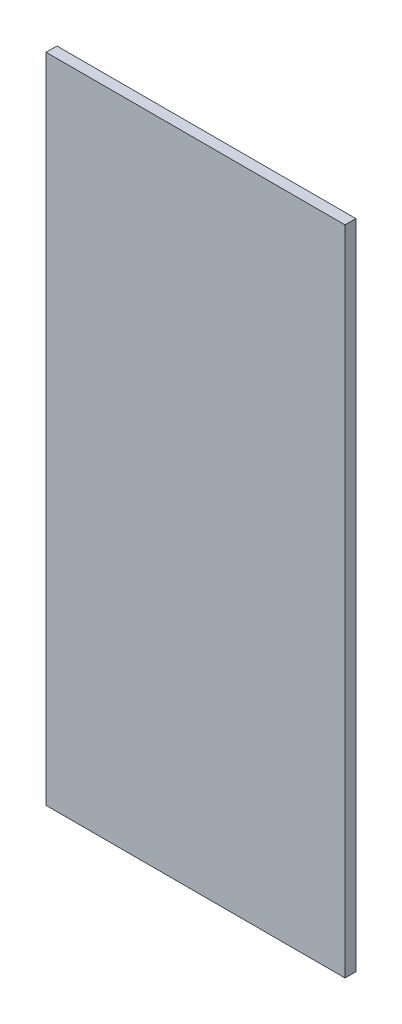
ISO-10303-21;
HEADER;
FILE_DESCRIPTION(('STEP AP214'),'2;1');
FILE_NAME('part.step','',(''),(''),'','','');
FILE_SCHEMA(('AUTOMOTIVE_DESIGN { 1 0 10303 214 1 1 1 1 }'));
ENDSEC;
DATA;
#1=APPLICATION_CONTEXT('core data for automotive mechanical design processes');
#2=APPLICATION_PROTOCOL_DEFINITION('international standard','automotive_design',2000,#1);
#3=PRODUCT_CONTEXT('',#1,'mechanical');
#4=PRODUCT('Part','Part','',(#3));
#5=PRODUCT_RELATED_PRODUCT_CATEGORY('part','',(#4));
#6=PRODUCT_DEFINITION_FORMATION('','',#4);
#7=PRODUCT_DEFINITION_CONTEXT('part definition',#1,'design');
#8=PRODUCT_DEFINITION('design','',#6,#7);
#9=PRODUCT_DEFINITION_SHAPE('','',#8);
#10=(LENGTH_UNIT() NAMED_UNIT(*) SI_UNIT(.MILLI.,.METRE.));
#11=(NAMED_UNIT(*) PLANE_ANGLE_UNIT() SI_UNIT($,.RADIAN.));
#12=(NAMED_UNIT(*) SI_UNIT($,.STERADIAN.) SOLID_ANGLE_UNIT());
#13=UNCERTAINTY_MEASURE_WITH_UNIT(LENGTH_MEASURE(1.E-05),#10,'distance_accuracy_value','');
#14=(GEOMETRIC_REPRESENTATION_CONTEXT(3) GLOBAL_UNCERTAINTY_ASSIGNED_CONTEXT((#13)) GLOBAL_UNIT_ASSIGNED_CONTEXT((#10,
#11,#12)) REPRESENTATION_CONTEXT('',''));
#15=CARTESIAN_POINT('',(0.,0.,0.));
#16=DIRECTION('',(0.,0.,1.));
#17=DIRECTION('',(1.,0.,0.));
#18=AXIS2_PLACEMENT_3D('',#15,#16,#17);
#19=CARTESIAN_POINT('',(31.5626278154866,21.8286116624995,1.99999999999997));
#20=DIRECTION('',(0.,-1.,0.));
#21=DIRECTION('',(0.,0.,-1.));
#22=AXIS2_PLACEMENT_3D('',#19,#20,#21);
#23=PLANE('',#22);
#24=DIRECTION('',(-1.,0.,0.));
#25=VECTOR('',#24,1.);
#26=CARTESIAN_POINT('',(31.5626278154866,21.8286116624995,0.));
#27=LINE('',#26,#25);
#28=CARTESIAN_POINT('',(31.5626278154866,21.8286116624995,0.));
#29=VERTEX_POINT('',#28);
#30=CARTESIAN_POINT('',(-23.4373721845134,21.8286116624995,0.));
#31=VERTEX_POINT('',#30);
#32=EDGE_CURVE('E96',#29,#31,#27,.T.);
#33=ORIENTED_EDGE('',*,*,#32,.T.);
#34=DIRECTION('',(0.,0.,-1.));
#35=VECTOR('',#34,1.);
#36=CARTESIAN_POINT('',(-23.4373721845134,21.8286116624995,1.99999999999997));
#37=LINE('',#36,#35);
#38=CARTESIAN_POINT('',(-23.4373721845134,21.8286116624995,1.99999999999997));
#39=VERTEX_POINT('',#38);
#40=EDGE_CURVE('E11',#39,#31,#37,.T.);
#41=ORIENTED_EDGE('',*,*,#40,.F.);
#42=DIRECTION('',(-1.,0.,0.));
#43=VECTOR('',#42,1.);
#44=CARTESIAN_POINT('',(31.5626278154866,21.8286116624995,1.99999999999997));
#45=LINE('',#44,#43);
#46=CARTESIAN_POINT('',(31.5626278154866,21.8286116624995,1.99999999999997));
#47=VERTEX_POINT('',#46);
#48=EDGE_CURVE('E84',#47,#39,#45,.T.);
#49=ORIENTED_EDGE('',*,*,#48,.F.);
#50=DIRECTION('',(0.,0.,-1.));
#51=VECTOR('',#50,1.);
#52=CARTESIAN_POINT('',(31.5626278154866,21.8286116624995,1.99999999999997));
#53=LINE('',#52,#51);
#54=EDGE_CURVE('E92',#47,#29,#53,.T.);
#55=ORIENTED_EDGE('',*,*,#54,.T.);
#56=EDGE_LOOP('',(#33,#41,#49,#55));
#57=FACE_BOUND('',#56,.T.);
#58=ADVANCED_FACE('F33',(#57),#23,.F.);
#59=CARTESIAN_POINT('',(-23.4373721845134,21.8286116624995,1.99999999999997));
#60=DIRECTION('',(1.,0.,0.));
#61=DIRECTION('',(0.,1.,0.));
#62=AXIS2_PLACEMENT_3D('',#59,#60,#61);
#63=PLANE('',#62);
#64=DIRECTION('',(0.,-1.,0.));
#65=VECTOR('',#64,1.);
#66=CARTESIAN_POINT('',(-23.4373721845134,21.8286116624995,0.));
#67=LINE('',#66,#65);
#68=CARTESIAN_POINT('',(-23.4373721845134,-98.1713883375005,0.));
#69=VERTEX_POINT('',#68);
#70=EDGE_CURVE('E88',#31,#69,#67,.T.);
#71=ORIENTED_EDGE('',*,*,#70,.T.);
#72=DIRECTION('',(0.,0.,-1.));
#73=VECTOR('',#72,1.);
#74=CARTESIAN_POINT('',(-23.4373721845134,-98.1713883375005,1.99999999999997));
#75=LINE('',#74,#73);
#76=CARTESIAN_POINT('',(-23.4373721845134,-98.1713883375005,1.99999999999997));
#77=VERTEX_POINT('',#76);
#78=EDGE_CURVE('E41',#77,#69,#75,.T.);
#79=ORIENTED_EDGE('',*,*,#78,.F.);
#80=DIRECTION('',(0.,-1.,0.));
#81=VECTOR('',#80,1.);
#82=CARTESIAN_POINT('',(-23.4373721845134,21.8286116624995,1.99999999999997));
#83=LINE('',#82,#81);
#84=EDGE_CURVE('E79',#39,#77,#83,.T.);
#85=ORIENTED_EDGE('',*,*,#84,.F.);
#86=ORIENTED_EDGE('',*,*,#40,.T.);
#87=EDGE_LOOP('',(#71,#79,#85,#86));
#88=FACE_BOUND('',#87,.T.);
#89=ADVANCED_FACE('F87',(#88),#63,.F.);
#90=CARTESIAN_POINT('',(-23.4373721845134,-98.1713883375005,1.99999999999997));
#91=DIRECTION('',(0.,1.,0.));
#92=DIRECTION('',(0.,0.,1.));
#93=AXIS2_PLACEMENT_3D('',#90,#91,#92);
#94=PLANE('',#93);
#95=DIRECTION('',(1.,0.,0.));
#96=VECTOR('',#95,1.);
#97=CARTESIAN_POINT('',(-23.4373721845134,-98.1713883375005,0.));
#98=LINE('',#97,#96);
#99=CARTESIAN_POINT('',(31.5626278154866,-98.1713883375005,0.));
#100=VERTEX_POINT('',#99);
#101=EDGE_CURVE('E66',#69,#100,#98,.T.);
#102=ORIENTED_EDGE('',*,*,#101,.T.);
#103=DIRECTION('',(0.,0.,-1.));
#104=VECTOR('',#103,1.);
#105=CARTESIAN_POINT('',(31.5626278154866,-98.1713883375005,1.99999999999997));
#106=LINE('',#105,#104);
#107=CARTESIAN_POINT('',(31.5626278154866,-98.1713883375005,1.99999999999997));
#108=VERTEX_POINT('',#107);
#109=EDGE_CURVE('E89',#108,#100,#106,.T.);
#110=ORIENTED_EDGE('',*,*,#109,.F.);
#111=DIRECTION('',(1.,0.,0.));
#112=VECTOR('',#111,1.);
#113=CARTESIAN_POINT('',(-23.4373721845134,-98.1713883375005,1.99999999999997));
#114=LINE('',#113,#112);
#115=EDGE_CURVE('E82',#77,#108,#114,.T.);
#116=ORIENTED_EDGE('',*,*,#115,.F.);
#117=ORIENTED_EDGE('',*,*,#78,.T.);
#118=EDGE_LOOP('',(#102,#110,#116,#117));
#119=FACE_BOUND('',#118,.T.);
#120=ADVANCED_FACE('F90',(#119),#94,.F.);
#121=CARTESIAN_POINT('',(31.5626278154866,-98.1713883375005,1.99999999999997));
#122=DIRECTION('',(-1.,0.,0.));
#123=DIRECTION('',(0.,0.,1.));
#124=AXIS2_PLACEMENT_3D('',#121,#122,#123);
#125=PLANE('',#124);
#126=DIRECTION('',(0.,1.,0.));
#127=VECTOR('',#126,1.);
#128=CARTESIAN_POINT('',(31.5626278154866,-98.1713883375005,0.));
#129=LINE('',#128,#127);
#130=EDGE_CURVE('E72',#100,#29,#129,.T.);
#131=ORIENTED_EDGE('',*,*,#130,.T.);
#132=ORIENTED_EDGE('',*,*,#54,.F.);
#133=DIRECTION('',(0.,1.,0.));
#134=VECTOR('',#133,1.);
#135=CARTESIAN_POINT('',(31.5626278154866,-98.1713883375005,1.99999999999997));
#136=LINE('',#135,#134);
#137=EDGE_CURVE('E49',#108,#47,#136,.T.);
#138=ORIENTED_EDGE('',*,*,#137,.F.);
#139=ORIENTED_EDGE('',*,*,#109,.T.);
#140=EDGE_LOOP('',(#131,#132,#138,#139));
#141=FACE_BOUND('',#140,.T.);
#142=ADVANCED_FACE('F103',(#141),#125,.F.);
#143=CARTESIAN_POINT('',(0.,0.,1.99999999999997));
#144=DIRECTION('',(0.,0.,1.));
#145=DIRECTION('',(1.,0.,0.));
#146=AXIS2_PLACEMENT_3D('',#143,#144,#145);
#147=PLANE('',#146);
#148=ORIENTED_EDGE('',*,*,#48,.T.);
#149=ORIENTED_EDGE('',*,*,#84,.T.);
#150=ORIENTED_EDGE('',*,*,#115,.T.);
#151=ORIENTED_EDGE('',*,*,#137,.T.);
#152=EDGE_LOOP('',(#148,#149,#150,#151));
#153=FACE_BOUND('',#152,.T.);
#154=ADVANCED_FACE('F80',(#153),#147,.T.);
#155=CARTESIAN_POINT('',(0.,0.,0.));
#156=DIRECTION('',(0.,0.,1.));
#157=DIRECTION('',(1.,0.,0.));
#158=AXIS2_PLACEMENT_3D('',#155,#156,#157);
#159=PLANE('',#158);
#160=ORIENTED_EDGE('',*,*,#32,.F.);
#161=ORIENTED_EDGE('',*,*,#130,.F.);
#162=ORIENTED_EDGE('',*,*,#101,.F.);
#163=ORIENTED_EDGE('',*,*,#70,.F.);
#164=EDGE_LOOP('',(#160,#161,#162,#163));
#165=FACE_BOUND('',#164,.T.);
#166=ADVANCED_FACE('F106',(#165),#159,.F.);
#167=CLOSED_SHELL('',(#58,#89,#120,#142,#154,#166));
#168=MANIFOLD_SOLID_BREP('B2',#167);
#169=ADVANCED_BREP_SHAPE_REPRESENTATION('',(#18,#168),#14);
#170=SHAPE_DEFINITION_REPRESENTATION(#9,#169);
ENDSEC;
END-ISO-10303-21;
